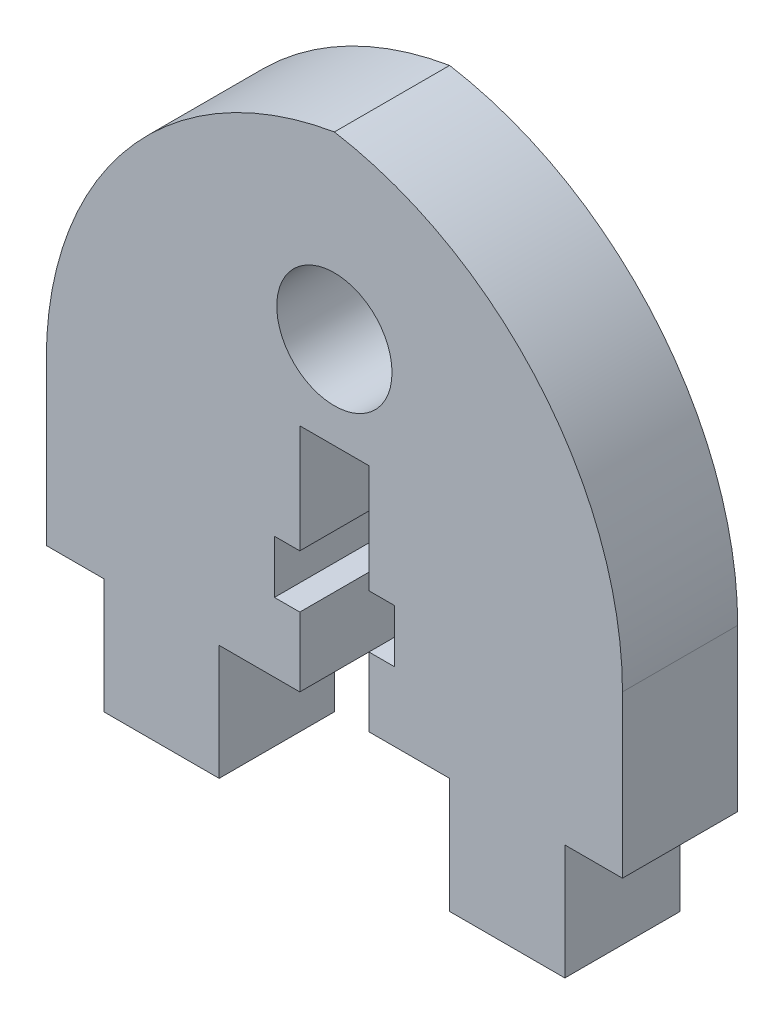
ISO-10303-21;
HEADER;
FILE_DESCRIPTION(('STEP AP214'),'2;1');
FILE_NAME('part.step','',(''),(''),'','','');
FILE_SCHEMA(('AUTOMOTIVE_DESIGN { 1 0 10303 214 1 1 1 1 }'));
ENDSEC;
DATA;
#1=APPLICATION_CONTEXT('core data for automotive mechanical design processes');
#2=APPLICATION_PROTOCOL_DEFINITION('international standard','automotive_design',2000,#1);
#3=PRODUCT_CONTEXT('',#1,'mechanical');
#4=PRODUCT('Part','Part','',(#3));
#5=PRODUCT_RELATED_PRODUCT_CATEGORY('part','',(#4));
#6=PRODUCT_DEFINITION_FORMATION('','',#4);
#7=PRODUCT_DEFINITION_CONTEXT('part definition',#1,'design');
#8=PRODUCT_DEFINITION('design','',#6,#7);
#9=PRODUCT_DEFINITION_SHAPE('','',#8);
#10=(LENGTH_UNIT() NAMED_UNIT(*) SI_UNIT(.MILLI.,.METRE.));
#11=(NAMED_UNIT(*) PLANE_ANGLE_UNIT() SI_UNIT($,.RADIAN.));
#12=(NAMED_UNIT(*) SI_UNIT($,.STERADIAN.) SOLID_ANGLE_UNIT());
#13=UNCERTAINTY_MEASURE_WITH_UNIT(LENGTH_MEASURE(1.E-05),#10,'distance_accuracy_value','');
#14=(GEOMETRIC_REPRESENTATION_CONTEXT(3) GLOBAL_UNCERTAINTY_ASSIGNED_CONTEXT((#13)) GLOBAL_UNIT_ASSIGNED_CONTEXT((#10,
#11,#12)) REPRESENTATION_CONTEXT('',''));
#15=CARTESIAN_POINT('',(0.,0.,0.));
#16=DIRECTION('',(0.,0.,1.));
#17=DIRECTION('',(1.,0.,0.));
#18=AXIS2_PLACEMENT_3D('',#15,#16,#17);
#19=CARTESIAN_POINT('',(-1.5,0.,5.));
#20=DIRECTION('',(1.,0.,0.));
#21=DIRECTION('',(0.,1.,0.));
#22=AXIS2_PLACEMENT_3D('',#19,#20,#21);
#23=PLANE('',#22);
#24=DIRECTION('',(0.,-1.,0.));
#25=VECTOR('',#24,1.);
#26=CARTESIAN_POINT('',(-1.5,0.,0.));
#27=LINE('',#26,#25);
#28=CARTESIAN_POINT('',(-1.5,-11.,0.));
#29=VERTEX_POINT('',#28);
#30=CARTESIAN_POINT('',(-1.5,-14.,0.));
#31=VERTEX_POINT('',#30);
#32=EDGE_CURVE('E210',#29,#31,#27,.T.);
#33=ORIENTED_EDGE('',*,*,#32,.F.);
#34=DIRECTION('',(0.,0.,-1.));
#35=VECTOR('',#34,1.);
#36=CARTESIAN_POINT('',(-1.5,-11.,5.));
#37=LINE('',#36,#35);
#38=CARTESIAN_POINT('',(-1.5,-11.,5.));
#39=VERTEX_POINT('',#38);
#40=EDGE_CURVE('E205',#39,#29,#37,.T.);
#41=ORIENTED_EDGE('',*,*,#40,.F.);
#42=DIRECTION('',(0.,-1.,0.));
#43=VECTOR('',#42,1.);
#44=CARTESIAN_POINT('',(-1.5,0.,5.));
#45=LINE('',#44,#43);
#46=CARTESIAN_POINT('',(-1.5,-14.,5.));
#47=VERTEX_POINT('',#46);
#48=EDGE_CURVE('E208',#39,#47,#45,.T.);
#49=ORIENTED_EDGE('',*,*,#48,.T.);
#50=DIRECTION('',(0.,0.,-1.));
#51=VECTOR('',#50,1.);
#52=CARTESIAN_POINT('',(-1.5,-14.,5.));
#53=LINE('',#52,#51);
#54=EDGE_CURVE('E372',#47,#31,#53,.T.);
#55=ORIENTED_EDGE('',*,*,#54,.T.);
#56=EDGE_LOOP('',(#33,#41,#49,#55));
#57=FACE_BOUND('',#56,.T.);
#58=ADVANCED_FACE('F37',(#57),#23,.T.);
#59=CARTESIAN_POINT('',(0.,-11.,5.));
#60=DIRECTION('',(0.,-1.,0.));
#61=DIRECTION('',(1.,0.,0.));
#62=AXIS2_PLACEMENT_3D('',#59,#60,#61);
#63=PLANE('',#62);
#64=DIRECTION('',(-1.,0.,0.));
#65=VECTOR('',#64,1.);
#66=CARTESIAN_POINT('',(0.,-11.,0.));
#67=LINE('',#66,#65);
#68=CARTESIAN_POINT('',(-2.6,-11.,0.));
#69=VERTEX_POINT('',#68);
#70=EDGE_CURVE('E422',#29,#69,#67,.T.);
#71=ORIENTED_EDGE('',*,*,#70,.T.);
#72=DIRECTION('',(0.,0.,-1.));
#73=VECTOR('',#72,1.);
#74=CARTESIAN_POINT('',(-2.6,-11.,5.));
#75=LINE('',#74,#73);
#76=CARTESIAN_POINT('',(-2.6,-11.,5.));
#77=VERTEX_POINT('',#76);
#78=EDGE_CURVE('E214',#77,#69,#75,.T.);
#79=ORIENTED_EDGE('',*,*,#78,.F.);
#80=DIRECTION('',(-1.,0.,0.));
#81=VECTOR('',#80,1.);
#82=CARTESIAN_POINT('',(0.,-11.,5.));
#83=LINE('',#82,#81);
#84=EDGE_CURVE('E217',#39,#77,#83,.T.);
#85=ORIENTED_EDGE('',*,*,#84,.F.);
#86=ORIENTED_EDGE('',*,*,#40,.T.);
#87=EDGE_LOOP('',(#71,#79,#85,#86));
#88=FACE_BOUND('',#87,.T.);
#89=ADVANCED_FACE('F218',(#88),#63,.F.);
#90=CARTESIAN_POINT('',(-2.60000000000001,0.,5.));
#91=DIRECTION('',(-1.,0.,0.));
#92=DIRECTION('',(0.,-1.,0.));
#93=AXIS2_PLACEMENT_3D('',#90,#91,#92);
#94=PLANE('',#93);
#95=DIRECTION('',(0.,1.,0.));
#96=VECTOR('',#95,1.);
#97=CARTESIAN_POINT('',(-2.60000000000001,0.,0.));
#98=LINE('',#97,#96);
#99=CARTESIAN_POINT('',(-2.6,-8.7,0.));
#100=VERTEX_POINT('',#99);
#101=EDGE_CURVE('E420',#69,#100,#98,.T.);
#102=ORIENTED_EDGE('',*,*,#101,.T.);
#103=DIRECTION('',(0.,0.,-1.));
#104=VECTOR('',#103,1.);
#105=CARTESIAN_POINT('',(-2.6,-8.7,5.));
#106=LINE('',#105,#104);
#107=CARTESIAN_POINT('',(-2.6,-8.7,5.));
#108=VERTEX_POINT('',#107);
#109=EDGE_CURVE('E325',#108,#100,#106,.T.);
#110=ORIENTED_EDGE('',*,*,#109,.F.);
#111=DIRECTION('',(0.,1.,0.));
#112=VECTOR('',#111,1.);
#113=CARTESIAN_POINT('',(-2.60000000000001,0.,5.));
#114=LINE('',#113,#112);
#115=EDGE_CURVE('E221',#77,#108,#114,.T.);
#116=ORIENTED_EDGE('',*,*,#115,.F.);
#117=ORIENTED_EDGE('',*,*,#78,.T.);
#118=EDGE_LOOP('',(#102,#110,#116,#117));
#119=FACE_BOUND('',#118,.T.);
#120=ADVANCED_FACE('F501',(#119),#94,.F.);
#121=CARTESIAN_POINT('',(0.,-8.70000000000001,5.));
#122=DIRECTION('',(0.,1.,0.));
#123=DIRECTION('',(-1.,0.,0.));
#124=AXIS2_PLACEMENT_3D('',#121,#122,#123);
#125=PLANE('',#124);
#126=DIRECTION('',(1.,0.,0.));
#127=VECTOR('',#126,1.);
#128=CARTESIAN_POINT('',(0.,-8.70000000000001,0.));
#129=LINE('',#128,#127);
#130=CARTESIAN_POINT('',(-1.5,-8.7,0.));
#131=VERTEX_POINT('',#130);
#132=EDGE_CURVE('E417',#100,#131,#129,.T.);
#133=ORIENTED_EDGE('',*,*,#132,.T.);
#134=DIRECTION('',(0.,0.,-1.));
#135=VECTOR('',#134,1.);
#136=CARTESIAN_POINT('',(-1.5,-8.7,5.));
#137=LINE('',#136,#135);
#138=CARTESIAN_POINT('',(-1.5,-8.7,5.));
#139=VERTEX_POINT('',#138);
#140=EDGE_CURVE('E328',#139,#131,#137,.T.);
#141=ORIENTED_EDGE('',*,*,#140,.F.);
#142=DIRECTION('',(1.,0.,0.));
#143=VECTOR('',#142,1.);
#144=CARTESIAN_POINT('',(0.,-8.70000000000001,5.));
#145=LINE('',#144,#143);
#146=EDGE_CURVE('E246',#108,#139,#145,.T.);
#147=ORIENTED_EDGE('',*,*,#146,.F.);
#148=ORIENTED_EDGE('',*,*,#109,.T.);
#149=EDGE_LOOP('',(#133,#141,#147,#148));
#150=FACE_BOUND('',#149,.T.);
#151=ADVANCED_FACE('F509',(#150),#125,.F.);
#152=CARTESIAN_POINT('',(-1.5,0.,5.));
#153=DIRECTION('',(1.,0.,0.));
#154=DIRECTION('',(0.,1.,0.));
#155=AXIS2_PLACEMENT_3D('',#152,#153,#154);
#156=PLANE('',#155);
#157=DIRECTION('',(0.,-1.,0.));
#158=VECTOR('',#157,1.);
#159=CARTESIAN_POINT('',(-1.5,0.,0.));
#160=LINE('',#159,#158);
#161=CARTESIAN_POINT('',(-1.5,-4.,0.));
#162=VERTEX_POINT('',#161);
#163=EDGE_CURVE('E414',#162,#131,#160,.T.);
#164=ORIENTED_EDGE('',*,*,#163,.F.);
#165=DIRECTION('',(0.,0.,-1.));
#166=VECTOR('',#165,1.);
#167=CARTESIAN_POINT('',(-1.5,-4.,5.));
#168=LINE('',#167,#166);
#169=CARTESIAN_POINT('',(-1.5,-4.,5.));
#170=VERTEX_POINT('',#169);
#171=EDGE_CURVE('E330',#170,#162,#168,.T.);
#172=ORIENTED_EDGE('',*,*,#171,.F.);
#173=DIRECTION('',(0.,-1.,0.));
#174=VECTOR('',#173,1.);
#175=CARTESIAN_POINT('',(-1.5,0.,5.));
#176=LINE('',#175,#174);
#177=EDGE_CURVE('E249',#170,#139,#176,.T.);
#178=ORIENTED_EDGE('',*,*,#177,.T.);
#179=ORIENTED_EDGE('',*,*,#140,.T.);
#180=EDGE_LOOP('',(#164,#172,#178,#179));
#181=FACE_BOUND('',#180,.T.);
#182=ADVANCED_FACE('F512',(#181),#156,.T.);
#183=CARTESIAN_POINT('',(0.,-4.,5.));
#184=DIRECTION('',(0.,-1.,0.));
#185=DIRECTION('',(0.,0.,-1.));
#186=AXIS2_PLACEMENT_3D('',#183,#184,#185);
#187=PLANE('',#186);
#188=DIRECTION('',(-1.,0.,0.));
#189=VECTOR('',#188,1.);
#190=CARTESIAN_POINT('',(0.,-4.,0.));
#191=LINE('',#190,#189);
#192=CARTESIAN_POINT('',(1.5,-4.,0.));
#193=VERTEX_POINT('',#192);
#194=EDGE_CURVE('E411',#193,#162,#191,.T.);
#195=ORIENTED_EDGE('',*,*,#194,.F.);
#196=DIRECTION('',(0.,0.,-1.));
#197=VECTOR('',#196,1.);
#198=CARTESIAN_POINT('',(1.5,-4.,5.));
#199=LINE('',#198,#197);
#200=CARTESIAN_POINT('',(1.5,-4.,5.));
#201=VERTEX_POINT('',#200);
#202=EDGE_CURVE('E332',#201,#193,#199,.T.);
#203=ORIENTED_EDGE('',*,*,#202,.F.);
#204=DIRECTION('',(-1.,0.,0.));
#205=VECTOR('',#204,1.);
#206=CARTESIAN_POINT('',(0.,-4.,5.));
#207=LINE('',#206,#205);
#208=EDGE_CURVE('E253',#201,#170,#207,.T.);
#209=ORIENTED_EDGE('',*,*,#208,.T.);
#210=ORIENTED_EDGE('',*,*,#171,.T.);
#211=EDGE_LOOP('',(#195,#203,#209,#210));
#212=FACE_BOUND('',#211,.T.);
#213=ADVANCED_FACE('F515',(#212),#187,.T.);
#214=CARTESIAN_POINT('',(1.5,0.,5.));
#215=DIRECTION('',(-1.,0.,0.));
#216=DIRECTION('',(0.,-1.,0.));
#217=AXIS2_PLACEMENT_3D('',#214,#215,#216);
#218=PLANE('',#217);
#219=DIRECTION('',(0.,1.,0.));
#220=VECTOR('',#219,1.);
#221=CARTESIAN_POINT('',(1.5,0.,0.));
#222=LINE('',#221,#220);
#223=CARTESIAN_POINT('',(1.5,-8.7,0.));
#224=VERTEX_POINT('',#223);
#225=EDGE_CURVE('E408',#224,#193,#222,.T.);
#226=ORIENTED_EDGE('',*,*,#225,.F.);
#227=DIRECTION('',(0.,0.,-1.));
#228=VECTOR('',#227,1.);
#229=CARTESIAN_POINT('',(1.5,-8.7,5.));
#230=LINE('',#229,#228);
#231=CARTESIAN_POINT('',(1.5,-8.7,5.));
#232=VERTEX_POINT('',#231);
#233=EDGE_CURVE('E334',#232,#224,#230,.T.);
#234=ORIENTED_EDGE('',*,*,#233,.F.);
#235=DIRECTION('',(0.,1.,0.));
#236=VECTOR('',#235,1.);
#237=CARTESIAN_POINT('',(1.5,0.,5.));
#238=LINE('',#237,#236);
#239=EDGE_CURVE('E261',#232,#201,#238,.T.);
#240=ORIENTED_EDGE('',*,*,#239,.T.);
#241=ORIENTED_EDGE('',*,*,#202,.T.);
#242=EDGE_LOOP('',(#226,#234,#240,#241));
#243=FACE_BOUND('',#242,.T.);
#244=ADVANCED_FACE('F519',(#243),#218,.T.);
#245=CARTESIAN_POINT('',(0.,-8.70000000000001,5.));
#246=DIRECTION('',(0.,1.,0.));
#247=DIRECTION('',(-1.,0.,0.));
#248=AXIS2_PLACEMENT_3D('',#245,#246,#247);
#249=PLANE('',#248);
#250=DIRECTION('',(1.,0.,0.));
#251=VECTOR('',#250,1.);
#252=CARTESIAN_POINT('',(0.,-8.70000000000001,0.));
#253=LINE('',#252,#251);
#254=CARTESIAN_POINT('',(2.6,-8.7,0.));
#255=VERTEX_POINT('',#254);
#256=EDGE_CURVE('E406',#224,#255,#253,.T.);
#257=ORIENTED_EDGE('',*,*,#256,.T.);
#258=DIRECTION('',(0.,0.,-1.));
#259=VECTOR('',#258,1.);
#260=CARTESIAN_POINT('',(2.6,-8.7,5.));
#261=LINE('',#260,#259);
#262=CARTESIAN_POINT('',(2.6,-8.7,5.));
#263=VERTEX_POINT('',#262);
#264=EDGE_CURVE('E336',#263,#255,#261,.T.);
#265=ORIENTED_EDGE('',*,*,#264,.F.);
#266=DIRECTION('',(1.,0.,0.));
#267=VECTOR('',#266,1.);
#268=CARTESIAN_POINT('',(0.,-8.70000000000001,5.));
#269=LINE('',#268,#267);
#270=EDGE_CURVE('E264',#232,#263,#269,.T.);
#271=ORIENTED_EDGE('',*,*,#270,.F.);
#272=ORIENTED_EDGE('',*,*,#233,.T.);
#273=EDGE_LOOP('',(#257,#265,#271,#272));
#274=FACE_BOUND('',#273,.T.);
#275=ADVANCED_FACE('F524',(#274),#249,.F.);
#276=CARTESIAN_POINT('',(2.60000000000001,0.,5.));
#277=DIRECTION('',(1.,0.,0.));
#278=DIRECTION('',(0.,1.,0.));
#279=AXIS2_PLACEMENT_3D('',#276,#277,#278);
#280=PLANE('',#279);
#281=DIRECTION('',(0.,-1.,0.));
#282=VECTOR('',#281,1.);
#283=CARTESIAN_POINT('',(2.60000000000001,0.,0.));
#284=LINE('',#283,#282);
#285=CARTESIAN_POINT('',(2.6,-11.,0.));
#286=VERTEX_POINT('',#285);
#287=EDGE_CURVE('E404',#255,#286,#284,.T.);
#288=ORIENTED_EDGE('',*,*,#287,.T.);
#289=DIRECTION('',(0.,0.,-1.));
#290=VECTOR('',#289,1.);
#291=CARTESIAN_POINT('',(2.6,-11.,5.));
#292=LINE('',#291,#290);
#293=CARTESIAN_POINT('',(2.6,-11.,5.));
#294=VERTEX_POINT('',#293);
#295=EDGE_CURVE('E339',#294,#286,#292,.T.);
#296=ORIENTED_EDGE('',*,*,#295,.F.);
#297=DIRECTION('',(0.,-1.,0.));
#298=VECTOR('',#297,1.);
#299=CARTESIAN_POINT('',(2.60000000000001,0.,5.));
#300=LINE('',#299,#298);
#301=EDGE_CURVE('E267',#263,#294,#300,.T.);
#302=ORIENTED_EDGE('',*,*,#301,.F.);
#303=ORIENTED_EDGE('',*,*,#264,.T.);
#304=EDGE_LOOP('',(#288,#296,#302,#303));
#305=FACE_BOUND('',#304,.T.);
#306=ADVANCED_FACE('F530',(#305),#280,.F.);
#307=CARTESIAN_POINT('',(0.,-11.,5.));
#308=DIRECTION('',(0.,-1.,0.));
#309=DIRECTION('',(0.,0.,-1.));
#310=AXIS2_PLACEMENT_3D('',#307,#308,#309);
#311=PLANE('',#310);
#312=DIRECTION('',(-1.,0.,0.));
#313=VECTOR('',#312,1.);
#314=CARTESIAN_POINT('',(0.,-11.,0.));
#315=LINE('',#314,#313);
#316=CARTESIAN_POINT('',(1.5,-11.,0.));
#317=VERTEX_POINT('',#316);
#318=EDGE_CURVE('E401',#286,#317,#315,.T.);
#319=ORIENTED_EDGE('',*,*,#318,.T.);
#320=DIRECTION('',(0.,0.,-1.));
#321=VECTOR('',#320,1.);
#322=CARTESIAN_POINT('',(1.5,-11.,5.));
#323=LINE('',#322,#321);
#324=CARTESIAN_POINT('',(1.5,-11.,5.));
#325=VERTEX_POINT('',#324);
#326=EDGE_CURVE('E342',#325,#317,#323,.T.);
#327=ORIENTED_EDGE('',*,*,#326,.F.);
#328=DIRECTION('',(-1.,0.,0.));
#329=VECTOR('',#328,1.);
#330=CARTESIAN_POINT('',(0.,-11.,5.));
#331=LINE('',#330,#329);
#332=EDGE_CURVE('E270',#294,#325,#331,.T.);
#333=ORIENTED_EDGE('',*,*,#332,.F.);
#334=ORIENTED_EDGE('',*,*,#295,.T.);
#335=EDGE_LOOP('',(#319,#327,#333,#334));
#336=FACE_BOUND('',#335,.T.);
#337=ADVANCED_FACE('F534',(#336),#311,.F.);
#338=CARTESIAN_POINT('',(1.5,0.,5.));
#339=DIRECTION('',(-1.,0.,0.));
#340=DIRECTION('',(0.,0.,1.));
#341=AXIS2_PLACEMENT_3D('',#338,#339,#340);
#342=PLANE('',#341);
#343=DIRECTION('',(0.,1.,0.));
#344=VECTOR('',#343,1.);
#345=CARTESIAN_POINT('',(1.5,0.,0.));
#346=LINE('',#345,#344);
#347=CARTESIAN_POINT('',(1.5,-14.,0.));
#348=VERTEX_POINT('',#347);
#349=EDGE_CURVE('E398',#348,#317,#346,.T.);
#350=ORIENTED_EDGE('',*,*,#349,.F.);
#351=DIRECTION('',(0.,0.,-1.));
#352=VECTOR('',#351,1.);
#353=CARTESIAN_POINT('',(1.5,-14.,5.));
#354=LINE('',#353,#352);
#355=CARTESIAN_POINT('',(1.5,-14.,5.));
#356=VERTEX_POINT('',#355);
#357=EDGE_CURVE('E344',#356,#348,#354,.T.);
#358=ORIENTED_EDGE('',*,*,#357,.F.);
#359=DIRECTION('',(0.,1.,0.));
#360=VECTOR('',#359,1.);
#361=CARTESIAN_POINT('',(1.5,0.,5.));
#362=LINE('',#361,#360);
#363=EDGE_CURVE('E277',#356,#325,#362,.T.);
#364=ORIENTED_EDGE('',*,*,#363,.T.);
#365=ORIENTED_EDGE('',*,*,#326,.T.);
#366=EDGE_LOOP('',(#350,#358,#364,#365));
#367=FACE_BOUND('',#366,.T.);
#368=ADVANCED_FACE('F537',(#367),#342,.T.);
#369=CARTESIAN_POINT('',(0.,-14.,5.));
#370=DIRECTION('',(0.,1.,0.));
#371=DIRECTION('',(0.,0.,1.));
#372=AXIS2_PLACEMENT_3D('',#369,#370,#371);
#373=PLANE('',#372);
#374=DIRECTION('',(1.,0.,0.));
#375=VECTOR('',#374,1.);
#376=CARTESIAN_POINT('',(0.,-14.,0.));
#377=LINE('',#376,#375);
#378=CARTESIAN_POINT('',(5.,-14.,0.));
#379=VERTEX_POINT('',#378);
#380=EDGE_CURVE('E396',#348,#379,#377,.T.);
#381=ORIENTED_EDGE('',*,*,#380,.T.);
#382=DIRECTION('',(0.,0.,-1.));
#383=VECTOR('',#382,1.);
#384=CARTESIAN_POINT('',(5.,-14.,5.));
#385=LINE('',#384,#383);
#386=CARTESIAN_POINT('',(5.,-14.,5.));
#387=VERTEX_POINT('',#386);
#388=EDGE_CURVE('E346',#387,#379,#385,.T.);
#389=ORIENTED_EDGE('',*,*,#388,.F.);
#390=DIRECTION('',(1.,0.,0.));
#391=VECTOR('',#390,1.);
#392=CARTESIAN_POINT('',(0.,-14.,5.));
#393=LINE('',#392,#391);
#394=EDGE_CURVE('E280',#356,#387,#393,.T.);
#395=ORIENTED_EDGE('',*,*,#394,.F.);
#396=ORIENTED_EDGE('',*,*,#357,.T.);
#397=EDGE_LOOP('',(#381,#389,#395,#396));
#398=FACE_BOUND('',#397,.T.);
#399=ADVANCED_FACE('F540',(#398),#373,.F.);
#400=CARTESIAN_POINT('',(5.,0.,5.));
#401=DIRECTION('',(1.,0.,0.));
#402=DIRECTION('',(0.,1.,0.));
#403=AXIS2_PLACEMENT_3D('',#400,#401,#402);
#404=PLANE('',#403);
#405=DIRECTION('',(0.,-1.,0.));
#406=VECTOR('',#405,1.);
#407=CARTESIAN_POINT('',(5.,0.,0.));
#408=LINE('',#407,#406);
#409=CARTESIAN_POINT('',(5.,-19.,0.));
#410=VERTEX_POINT('',#409);
#411=EDGE_CURVE('E394',#379,#410,#408,.T.);
#412=ORIENTED_EDGE('',*,*,#411,.T.);
#413=DIRECTION('',(0.,0.,-1.));
#414=VECTOR('',#413,1.);
#415=CARTESIAN_POINT('',(5.,-19.,5.));
#416=LINE('',#415,#414);
#417=CARTESIAN_POINT('',(5.,-19.,5.));
#418=VERTEX_POINT('',#417);
#419=EDGE_CURVE('E349',#418,#410,#416,.T.);
#420=ORIENTED_EDGE('',*,*,#419,.F.);
#421=DIRECTION('',(0.,-1.,0.));
#422=VECTOR('',#421,1.);
#423=CARTESIAN_POINT('',(5.,0.,5.));
#424=LINE('',#423,#422);
#425=EDGE_CURVE('E283',#387,#418,#424,.T.);
#426=ORIENTED_EDGE('',*,*,#425,.F.);
#427=ORIENTED_EDGE('',*,*,#388,.T.);
#428=EDGE_LOOP('',(#412,#420,#426,#427));
#429=FACE_BOUND('',#428,.T.);
#430=ADVANCED_FACE('F455',(#429),#404,.F.);
#431=CARTESIAN_POINT('',(0.,-19.,5.));
#432=DIRECTION('',(0.,1.,0.));
#433=DIRECTION('',(0.,0.,1.));
#434=AXIS2_PLACEMENT_3D('',#431,#432,#433);
#435=PLANE('',#434);
#436=DIRECTION('',(1.,0.,0.));
#437=VECTOR('',#436,1.);
#438=CARTESIAN_POINT('',(0.,-19.,0.));
#439=LINE('',#438,#437);
#440=CARTESIAN_POINT('',(10.,-19.,0.));
#441=VERTEX_POINT('',#440);
#442=EDGE_CURVE('E392',#410,#441,#439,.T.);
#443=ORIENTED_EDGE('',*,*,#442,.T.);
#444=DIRECTION('',(0.,0.,-1.));
#445=VECTOR('',#444,1.);
#446=CARTESIAN_POINT('',(10.,-19.,5.));
#447=LINE('',#446,#445);
#448=CARTESIAN_POINT('',(10.,-19.,5.));
#449=VERTEX_POINT('',#448);
#450=EDGE_CURVE('E352',#449,#441,#447,.T.);
#451=ORIENTED_EDGE('',*,*,#450,.F.);
#452=DIRECTION('',(1.,0.,0.));
#453=VECTOR('',#452,1.);
#454=CARTESIAN_POINT('',(0.,-19.,5.));
#455=LINE('',#454,#453);
#456=EDGE_CURVE('E443',#418,#449,#455,.T.);
#457=ORIENTED_EDGE('',*,*,#456,.F.);
#458=ORIENTED_EDGE('',*,*,#419,.T.);
#459=EDGE_LOOP('',(#443,#451,#457,#458));
#460=FACE_BOUND('',#459,.T.);
#461=ADVANCED_FACE('F459',(#460),#435,.F.);
#462=CARTESIAN_POINT('',(10.,0.,5.));
#463=DIRECTION('',(-1.,0.,0.));
#464=DIRECTION('',(0.,0.,1.));
#465=AXIS2_PLACEMENT_3D('',#462,#463,#464);
#466=PLANE('',#465);
#467=DIRECTION('',(0.,1.,0.));
#468=VECTOR('',#467,1.);
#469=CARTESIAN_POINT('',(10.,0.,0.));
#470=LINE('',#469,#468);
#471=CARTESIAN_POINT('',(10.,-14.,0.));
#472=VERTEX_POINT('',#471);
#473=EDGE_CURVE('E390',#441,#472,#470,.T.);
#474=ORIENTED_EDGE('',*,*,#473,.T.);
#475=DIRECTION('',(0.,0.,-1.));
#476=VECTOR('',#475,1.);
#477=CARTESIAN_POINT('',(10.,-14.,5.));
#478=LINE('',#477,#476);
#479=CARTESIAN_POINT('',(10.,-14.,5.));
#480=VERTEX_POINT('',#479);
#481=EDGE_CURVE('E355',#480,#472,#478,.T.);
#482=ORIENTED_EDGE('',*,*,#481,.F.);
#483=DIRECTION('',(0.,1.,0.));
#484=VECTOR('',#483,1.);
#485=CARTESIAN_POINT('',(10.,0.,5.));
#486=LINE('',#485,#484);
#487=EDGE_CURVE('E302',#449,#480,#486,.T.);
#488=ORIENTED_EDGE('',*,*,#487,.F.);
#489=ORIENTED_EDGE('',*,*,#450,.T.);
#490=EDGE_LOOP('',(#474,#482,#488,#489));
#491=FACE_BOUND('',#490,.T.);
#492=ADVANCED_FACE('F462',(#491),#466,.F.);
#493=CARTESIAN_POINT('',(12.5,-14.,0.));
#494=VERTEX_POINT('',#493);
#495=EDGE_CURVE('E389',#472,#494,#377,.T.);
#496=ORIENTED_EDGE('',*,*,#495,.T.);
#497=DIRECTION('',(0.,0.,-1.));
#498=VECTOR('',#497,1.);
#499=CARTESIAN_POINT('',(12.5,-14.,5.));
#500=LINE('',#499,#498);
#501=CARTESIAN_POINT('',(12.5,-14.,5.));
#502=VERTEX_POINT('',#501);
#503=EDGE_CURVE('E358',#502,#494,#500,.T.);
#504=ORIENTED_EDGE('',*,*,#503,.F.);
#505=EDGE_CURVE('E284',#480,#502,#393,.T.);
#506=ORIENTED_EDGE('',*,*,#505,.F.);
#507=ORIENTED_EDGE('',*,*,#481,.T.);
#508=EDGE_LOOP('',(#496,#504,#506,#507));
#509=FACE_BOUND('',#508,.T.);
#510=ADVANCED_FACE('F465',(#509),#373,.F.);
#511=CARTESIAN_POINT('',(12.5,0.,5.));
#512=DIRECTION('',(-1.,0.,0.));
#513=DIRECTION('',(0.,0.,1.));
#514=AXIS2_PLACEMENT_3D('',#511,#512,#513);
#515=PLANE('',#514);
#516=DIRECTION('',(0.,1.,0.));
#517=VECTOR('',#516,1.);
#518=CARTESIAN_POINT('',(12.5,0.,0.));
#519=LINE('',#518,#517);
#520=CARTESIAN_POINT('',(12.5,-7.,0.));
#521=VERTEX_POINT('',#520);
#522=EDGE_CURVE('E387',#494,#521,#519,.T.);
#523=ORIENTED_EDGE('',*,*,#522,.T.);
#524=DIRECTION('',(0.,0.,-1.));
#525=VECTOR('',#524,1.);
#526=CARTESIAN_POINT('',(12.5,-7.,5.));
#527=LINE('',#526,#525);
#528=CARTESIAN_POINT('',(12.5,-7.,5.));
#529=VERTEX_POINT('',#528);
#530=EDGE_CURVE('E12',#521,#529,#527,.F.);
#531=ORIENTED_EDGE('',*,*,#530,.T.);
#532=DIRECTION('',(0.,1.,0.));
#533=VECTOR('',#532,1.);
#534=CARTESIAN_POINT('',(12.5,0.,5.));
#535=LINE('',#534,#533);
#536=EDGE_CURVE('E298',#502,#529,#535,.T.);
#537=ORIENTED_EDGE('',*,*,#536,.F.);
#538=ORIENTED_EDGE('',*,*,#503,.T.);
#539=EDGE_LOOP('',(#523,#531,#537,#538));
#540=FACE_BOUND('',#539,.T.);
#541=ADVANCED_FACE('F467',(#540),#515,.F.);
#542=CARTESIAN_POINT('',(-12.5,0.,5.));
#543=DIRECTION('',(-1.,0.,0.));
#544=DIRECTION('',(0.,0.,1.));
#545=AXIS2_PLACEMENT_3D('',#542,#543,#544);
#546=PLANE('',#545);
#547=DIRECTION('',(0.,1.,0.));
#548=VECTOR('',#547,1.);
#549=CARTESIAN_POINT('',(-12.5,0.,5.));
#550=LINE('',#549,#548);
#551=CARTESIAN_POINT('',(-12.5,-14.,5.));
#552=VERTEX_POINT('',#551);
#553=CARTESIAN_POINT('',(-12.5,-7.,5.));
#554=VERTEX_POINT('',#553);
#555=EDGE_CURVE('E301',#552,#554,#550,.T.);
#556=ORIENTED_EDGE('',*,*,#555,.T.);
#557=DIRECTION('',(0.,0.,-1.));
#558=VECTOR('',#557,1.);
#559=CARTESIAN_POINT('',(-12.5,-7.,5.));
#560=LINE('',#559,#558);
#561=CARTESIAN_POINT('',(-12.5,-7.,0.));
#562=VERTEX_POINT('',#561);
#563=EDGE_CURVE('E213',#554,#562,#560,.T.);
#564=ORIENTED_EDGE('',*,*,#563,.T.);
#565=DIRECTION('',(0.,1.,0.));
#566=VECTOR('',#565,1.);
#567=CARTESIAN_POINT('',(-12.5,0.,0.));
#568=LINE('',#567,#566);
#569=CARTESIAN_POINT('',(-12.5,-14.,0.));
#570=VERTEX_POINT('',#569);
#571=EDGE_CURVE('E384',#570,#562,#568,.T.);
#572=ORIENTED_EDGE('',*,*,#571,.F.);
#573=DIRECTION('',(0.,0.,-1.));
#574=VECTOR('',#573,1.);
#575=CARTESIAN_POINT('',(-12.5,-14.,5.));
#576=LINE('',#575,#574);
#577=EDGE_CURVE('E361',#552,#570,#576,.T.);
#578=ORIENTED_EDGE('',*,*,#577,.F.);
#579=EDGE_LOOP('',(#556,#564,#572,#578));
#580=FACE_BOUND('',#579,.T.);
#581=ADVANCED_FACE('F476',(#580),#546,.T.);
#582=CARTESIAN_POINT('',(-10.,-14.,0.));
#583=VERTEX_POINT('',#582);
#584=EDGE_CURVE('E383',#570,#583,#377,.T.);
#585=ORIENTED_EDGE('',*,*,#584,.T.);
#586=DIRECTION('',(0.,0.,-1.));
#587=VECTOR('',#586,1.);
#588=CARTESIAN_POINT('',(-10.,-14.,5.));
#589=LINE('',#588,#587);
#590=CARTESIAN_POINT('',(-10.,-14.,5.));
#591=VERTEX_POINT('',#590);
#592=EDGE_CURVE('E363',#591,#583,#589,.T.);
#593=ORIENTED_EDGE('',*,*,#592,.F.);
#594=EDGE_CURVE('E307',#552,#591,#393,.T.);
#595=ORIENTED_EDGE('',*,*,#594,.F.);
#596=ORIENTED_EDGE('',*,*,#577,.T.);
#597=EDGE_LOOP('',(#585,#593,#595,#596));
#598=FACE_BOUND('',#597,.T.);
#599=ADVANCED_FACE('F481',(#598),#373,.F.);
#600=CARTESIAN_POINT('',(-10.,0.,5.));
#601=DIRECTION('',(-1.,0.,0.));
#602=DIRECTION('',(0.,0.,1.));
#603=AXIS2_PLACEMENT_3D('',#600,#601,#602);
#604=PLANE('',#603);
#605=DIRECTION('',(0.,1.,0.));
#606=VECTOR('',#605,1.);
#607=CARTESIAN_POINT('',(-10.,0.,0.));
#608=LINE('',#607,#606);
#609=CARTESIAN_POINT('',(-10.,-19.,0.));
#610=VERTEX_POINT('',#609);
#611=EDGE_CURVE('E380',#610,#583,#608,.T.);
#612=ORIENTED_EDGE('',*,*,#611,.F.);
#613=DIRECTION('',(0.,0.,-1.));
#614=VECTOR('',#613,1.);
#615=CARTESIAN_POINT('',(-10.,-19.,5.));
#616=LINE('',#615,#614);
#617=CARTESIAN_POINT('',(-10.,-19.,5.));
#618=VERTEX_POINT('',#617);
#619=EDGE_CURVE('E365',#618,#610,#616,.T.);
#620=ORIENTED_EDGE('',*,*,#619,.F.);
#621=DIRECTION('',(0.,1.,0.));
#622=VECTOR('',#621,1.);
#623=CARTESIAN_POINT('',(-10.,0.,5.));
#624=LINE('',#623,#622);
#625=EDGE_CURVE('E308',#618,#591,#624,.T.);
#626=ORIENTED_EDGE('',*,*,#625,.T.);
#627=ORIENTED_EDGE('',*,*,#592,.T.);
#628=EDGE_LOOP('',(#612,#620,#626,#627));
#629=FACE_BOUND('',#628,.T.);
#630=ADVANCED_FACE('F483',(#629),#604,.T.);
#631=CARTESIAN_POINT('',(0.,-19.,5.));
#632=DIRECTION('',(0.,-1.,0.));
#633=DIRECTION('',(0.,0.,-1.));
#634=AXIS2_PLACEMENT_3D('',#631,#632,#633);
#635=PLANE('',#634);
#636=DIRECTION('',(-1.,0.,0.));
#637=VECTOR('',#636,1.);
#638=CARTESIAN_POINT('',(0.,-19.,0.));
#639=LINE('',#638,#637);
#640=CARTESIAN_POINT('',(-5.,-19.,0.));
#641=VERTEX_POINT('',#640);
#642=EDGE_CURVE('E377',#641,#610,#639,.T.);
#643=ORIENTED_EDGE('',*,*,#642,.F.);
#644=DIRECTION('',(0.,0.,-1.));
#645=VECTOR('',#644,1.);
#646=CARTESIAN_POINT('',(-5.,-19.,5.));
#647=LINE('',#646,#645);
#648=CARTESIAN_POINT('',(-5.,-19.,5.));
#649=VERTEX_POINT('',#648);
#650=EDGE_CURVE('E367',#649,#641,#647,.T.);
#651=ORIENTED_EDGE('',*,*,#650,.F.);
#652=DIRECTION('',(-1.,0.,0.));
#653=VECTOR('',#652,1.);
#654=CARTESIAN_POINT('',(0.,-19.,5.));
#655=LINE('',#654,#653);
#656=EDGE_CURVE('E429',#649,#618,#655,.T.);
#657=ORIENTED_EDGE('',*,*,#656,.T.);
#658=ORIENTED_EDGE('',*,*,#619,.T.);
#659=EDGE_LOOP('',(#643,#651,#657,#658));
#660=FACE_BOUND('',#659,.T.);
#661=ADVANCED_FACE('F490',(#660),#635,.T.);
#662=CARTESIAN_POINT('',(-5.,0.,5.));
#663=DIRECTION('',(-1.,0.,0.));
#664=DIRECTION('',(0.,-1.,0.));
#665=AXIS2_PLACEMENT_3D('',#662,#663,#664);
#666=PLANE('',#665);
#667=DIRECTION('',(0.,1.,0.));
#668=VECTOR('',#667,1.);
#669=CARTESIAN_POINT('',(-5.,0.,0.));
#670=LINE('',#669,#668);
#671=CARTESIAN_POINT('',(-5.,-14.,0.));
#672=VERTEX_POINT('',#671);
#673=EDGE_CURVE('E375',#641,#672,#670,.T.);
#674=ORIENTED_EDGE('',*,*,#673,.T.);
#675=DIRECTION('',(0.,0.,-1.));
#676=VECTOR('',#675,1.);
#677=CARTESIAN_POINT('',(-5.,-14.,5.));
#678=LINE('',#677,#676);
#679=CARTESIAN_POINT('',(-5.,-14.,5.));
#680=VERTEX_POINT('',#679);
#681=EDGE_CURVE('E369',#680,#672,#678,.T.);
#682=ORIENTED_EDGE('',*,*,#681,.F.);
#683=DIRECTION('',(0.,1.,0.));
#684=VECTOR('',#683,1.);
#685=CARTESIAN_POINT('',(-5.,0.,5.));
#686=LINE('',#685,#684);
#687=EDGE_CURVE('E427',#649,#680,#686,.T.);
#688=ORIENTED_EDGE('',*,*,#687,.F.);
#689=ORIENTED_EDGE('',*,*,#650,.T.);
#690=EDGE_LOOP('',(#674,#682,#688,#689));
#691=FACE_BOUND('',#690,.T.);
#692=ADVANCED_FACE('F494',(#691),#666,.F.);
#693=EDGE_CURVE('E231',#672,#31,#377,.T.);
#694=ORIENTED_EDGE('',*,*,#693,.T.);
#695=ORIENTED_EDGE('',*,*,#54,.F.);
#696=EDGE_CURVE('E226',#680,#47,#393,.T.);
#697=ORIENTED_EDGE('',*,*,#696,.F.);
#698=ORIENTED_EDGE('',*,*,#681,.T.);
#699=EDGE_LOOP('',(#694,#695,#697,#698));
#700=FACE_BOUND('',#699,.T.);
#701=ADVANCED_FACE('F497',(#700),#373,.F.);
#702=CARTESIAN_POINT('',(0.,0.,5.));
#703=DIRECTION('',(0.,0.,-1.));
#704=DIRECTION('',(-1.,0.,0.));
#705=AXIS2_PLACEMENT_3D('',#702,#703,#704);
#706=CYLINDRICAL_SURFACE('',#705,2.5);
#707=CARTESIAN_POINT('',(0.,0.,5.));
#708=DIRECTION('',(0.,0.,1.));
#709=DIRECTION('',(1.,0.,0.));
#710=AXIS2_PLACEMENT_3D('',#707,#708,#709);
#711=CIRCLE('',#710,2.5);
#712=CARTESIAN_POINT('',(2.5,0.,5.));
#713=VERTEX_POINT('',#712);
#714=EDGE_CURVE('E373',#713,#713,#711,.T.);
#715=ORIENTED_EDGE('',*,*,#714,.T.);
#716=EDGE_LOOP('',(#715));
#717=FACE_BOUND('',#716,.T.);
#718=CARTESIAN_POINT('',(0.,0.,0.));
#719=DIRECTION('',(0.,0.,1.));
#720=DIRECTION('',(1.,0.,0.));
#721=AXIS2_PLACEMENT_3D('',#718,#719,#720);
#722=CIRCLE('',#721,2.5);
#723=CARTESIAN_POINT('',(2.5,0.,0.));
#724=VERTEX_POINT('',#723);
#725=EDGE_CURVE('E228',#724,#724,#722,.T.);
#726=ORIENTED_EDGE('',*,*,#725,.F.);
#727=EDGE_LOOP('',(#726));
#728=FACE_BOUND('',#727,.T.);
#729=ADVANCED_FACE('F553',(#717,#728),#706,.F.);
#730=CARTESIAN_POINT('',(0.,0.,5.));
#731=DIRECTION('',(0.,0.,1.));
#732=DIRECTION('',(1.,0.,0.));
#733=AXIS2_PLACEMENT_3D('',#730,#731,#732);
#734=PLANE('',#733);
#735=CARTESIAN_POINT('',(-2.5,-7.,5.));
#736=DIRECTION('',(0.,0.,1.));
#737=DIRECTION('',(1.,0.,0.));
#738=AXIS2_PLACEMENT_3D('',#735,#736,#737);
#739=CIRCLE('',#738,15.);
#740=CARTESIAN_POINT('',(0.,7.79019945774904,5.));
#741=VERTEX_POINT('',#740);
#742=EDGE_CURVE('E53',#529,#741,#739,.T.);
#743=ORIENTED_EDGE('',*,*,#742,.T.);
#744=CARTESIAN_POINT('',(2.5,-7.,5.));
#745=DIRECTION('',(0.,0.,1.));
#746=DIRECTION('',(1.,0.,0.));
#747=AXIS2_PLACEMENT_3D('',#744,#745,#746);
#748=CIRCLE('',#747,15.);
#749=EDGE_CURVE('E46',#741,#554,#748,.T.);
#750=ORIENTED_EDGE('',*,*,#749,.T.);
#751=ORIENTED_EDGE('',*,*,#555,.F.);
#752=ORIENTED_EDGE('',*,*,#594,.T.);
#753=ORIENTED_EDGE('',*,*,#625,.F.);
#754=ORIENTED_EDGE('',*,*,#656,.F.);
#755=ORIENTED_EDGE('',*,*,#687,.T.);
#756=ORIENTED_EDGE('',*,*,#696,.T.);
#757=ORIENTED_EDGE('',*,*,#48,.F.);
#758=ORIENTED_EDGE('',*,*,#84,.T.);
#759=ORIENTED_EDGE('',*,*,#115,.T.);
#760=ORIENTED_EDGE('',*,*,#146,.T.);
#761=ORIENTED_EDGE('',*,*,#177,.F.);
#762=ORIENTED_EDGE('',*,*,#208,.F.);
#763=ORIENTED_EDGE('',*,*,#239,.F.);
#764=ORIENTED_EDGE('',*,*,#270,.T.);
#765=ORIENTED_EDGE('',*,*,#301,.T.);
#766=ORIENTED_EDGE('',*,*,#332,.T.);
#767=ORIENTED_EDGE('',*,*,#363,.F.);
#768=ORIENTED_EDGE('',*,*,#394,.T.);
#769=ORIENTED_EDGE('',*,*,#425,.T.);
#770=ORIENTED_EDGE('',*,*,#456,.T.);
#771=ORIENTED_EDGE('',*,*,#487,.T.);
#772=ORIENTED_EDGE('',*,*,#505,.T.);
#773=ORIENTED_EDGE('',*,*,#536,.T.);
#774=EDGE_LOOP('',(#743,#750,#751,#752,#753,#754,#755,#756,#757,#758,#759,#760,#761,#762,#763,
#764,#765,#766,#767,#768,#769,#770,#771,#772,#773));
#775=FACE_BOUND('',#774,.T.);
#776=ORIENTED_EDGE('',*,*,#714,.F.);
#777=EDGE_LOOP('',(#776));
#778=FACE_BOUND('',#777,.T.);
#779=ADVANCED_FACE('F223',(#775,#778),#734,.T.);
#780=CARTESIAN_POINT('',(0.,0.,0.));
#781=DIRECTION('',(0.,0.,1.));
#782=DIRECTION('',(1.,0.,0.));
#783=AXIS2_PLACEMENT_3D('',#780,#781,#782);
#784=PLANE('',#783);
#785=ORIENTED_EDGE('',*,*,#571,.T.);
#786=CARTESIAN_POINT('',(2.5,-7.,0.));
#787=DIRECTION('',(0.,0.,1.));
#788=DIRECTION('',(1.,0.,0.));
#789=AXIS2_PLACEMENT_3D('',#786,#787,#788);
#790=CIRCLE('',#789,15.);
#791=CARTESIAN_POINT('',(0.,7.79019945774904,0.));
#792=VERTEX_POINT('',#791);
#793=EDGE_CURVE('E318',#562,#792,#790,.F.);
#794=ORIENTED_EDGE('',*,*,#793,.T.);
#795=CARTESIAN_POINT('',(-2.5,-7.,0.));
#796=DIRECTION('',(0.,0.,1.));
#797=DIRECTION('',(1.,0.,0.));
#798=AXIS2_PLACEMENT_3D('',#795,#796,#797);
#799=CIRCLE('',#798,15.);
#800=EDGE_CURVE('E320',#792,#521,#799,.F.);
#801=ORIENTED_EDGE('',*,*,#800,.T.);
#802=ORIENTED_EDGE('',*,*,#522,.F.);
#803=ORIENTED_EDGE('',*,*,#495,.F.);
#804=ORIENTED_EDGE('',*,*,#473,.F.);
#805=ORIENTED_EDGE('',*,*,#442,.F.);
#806=ORIENTED_EDGE('',*,*,#411,.F.);
#807=ORIENTED_EDGE('',*,*,#380,.F.);
#808=ORIENTED_EDGE('',*,*,#349,.T.);
#809=ORIENTED_EDGE('',*,*,#318,.F.);
#810=ORIENTED_EDGE('',*,*,#287,.F.);
#811=ORIENTED_EDGE('',*,*,#256,.F.);
#812=ORIENTED_EDGE('',*,*,#225,.T.);
#813=ORIENTED_EDGE('',*,*,#194,.T.);
#814=ORIENTED_EDGE('',*,*,#163,.T.);
#815=ORIENTED_EDGE('',*,*,#132,.F.);
#816=ORIENTED_EDGE('',*,*,#101,.F.);
#817=ORIENTED_EDGE('',*,*,#70,.F.);
#818=ORIENTED_EDGE('',*,*,#32,.T.);
#819=ORIENTED_EDGE('',*,*,#693,.F.);
#820=ORIENTED_EDGE('',*,*,#673,.F.);
#821=ORIENTED_EDGE('',*,*,#642,.T.);
#822=ORIENTED_EDGE('',*,*,#611,.T.);
#823=ORIENTED_EDGE('',*,*,#584,.F.);
#824=EDGE_LOOP('',(#785,#794,#801,#802,#803,#804,#805,#806,#807,#808,#809,#810,#811,#812,#813,
#814,#815,#816,#817,#818,#819,#820,#821,#822,#823));
#825=FACE_BOUND('',#824,.T.);
#826=ORIENTED_EDGE('',*,*,#725,.T.);
#827=EDGE_LOOP('',(#826));
#828=FACE_BOUND('',#827,.T.);
#829=ADVANCED_FACE('F487',(#825,#828),#784,.F.);
#830=CARTESIAN_POINT('',(-2.5,-7.,5.));
#831=DIRECTION('',(0.,0.,1.));
#832=DIRECTION('',(1.,0.,0.));
#833=AXIS2_PLACEMENT_3D('',#830,#831,#832);
#834=CYLINDRICAL_SURFACE('',#833,15.);
#835=DIRECTION('',(0.,0.,1.));
#836=VECTOR('',#835,1.);
#837=CARTESIAN_POINT('',(0.,7.79019945774904,2.5));
#838=LINE('',#837,#836);
#839=EDGE_CURVE('E41',#741,#792,#838,.F.);
#840=ORIENTED_EDGE('',*,*,#839,.F.);
#841=ORIENTED_EDGE('',*,*,#742,.F.);
#842=ORIENTED_EDGE('',*,*,#530,.F.);
#843=ORIENTED_EDGE('',*,*,#800,.F.);
#844=EDGE_LOOP('',(#840,#841,#842,#843));
#845=FACE_BOUND('',#844,.T.);
#846=ADVANCED_FACE('F39',(#845),#834,.T.);
#847=CARTESIAN_POINT('',(2.5,-7.,5.));
#848=DIRECTION('',(0.,0.,-1.));
#849=DIRECTION('',(-1.,0.,0.));
#850=AXIS2_PLACEMENT_3D('',#847,#848,#849);
#851=CYLINDRICAL_SURFACE('',#850,15.);
#852=ORIENTED_EDGE('',*,*,#749,.F.);
#853=ORIENTED_EDGE('',*,*,#839,.T.);
#854=ORIENTED_EDGE('',*,*,#793,.F.);
#855=ORIENTED_EDGE('',*,*,#563,.F.);
#856=EDGE_LOOP('',(#852,#853,#854,#855));
#857=FACE_BOUND('',#856,.T.);
#858=ADVANCED_FACE('F474',(#857),#851,.T.);
#859=CLOSED_SHELL('',(#58,#89,#120,#151,#182,#213,#244,#275,#306,#337,#368,#399,#430,#461,#492,
#510,#541,#581,#599,#630,#661,#692,#701,#729,#779,#829,#846,#858));
#860=MANIFOLD_SOLID_BREP('B2',#859);
#861=ADVANCED_BREP_SHAPE_REPRESENTATION('',(#18,#860),#14);
#862=SHAPE_DEFINITION_REPRESENTATION(#9,#861);
ENDSEC;
END-ISO-10303-21;
